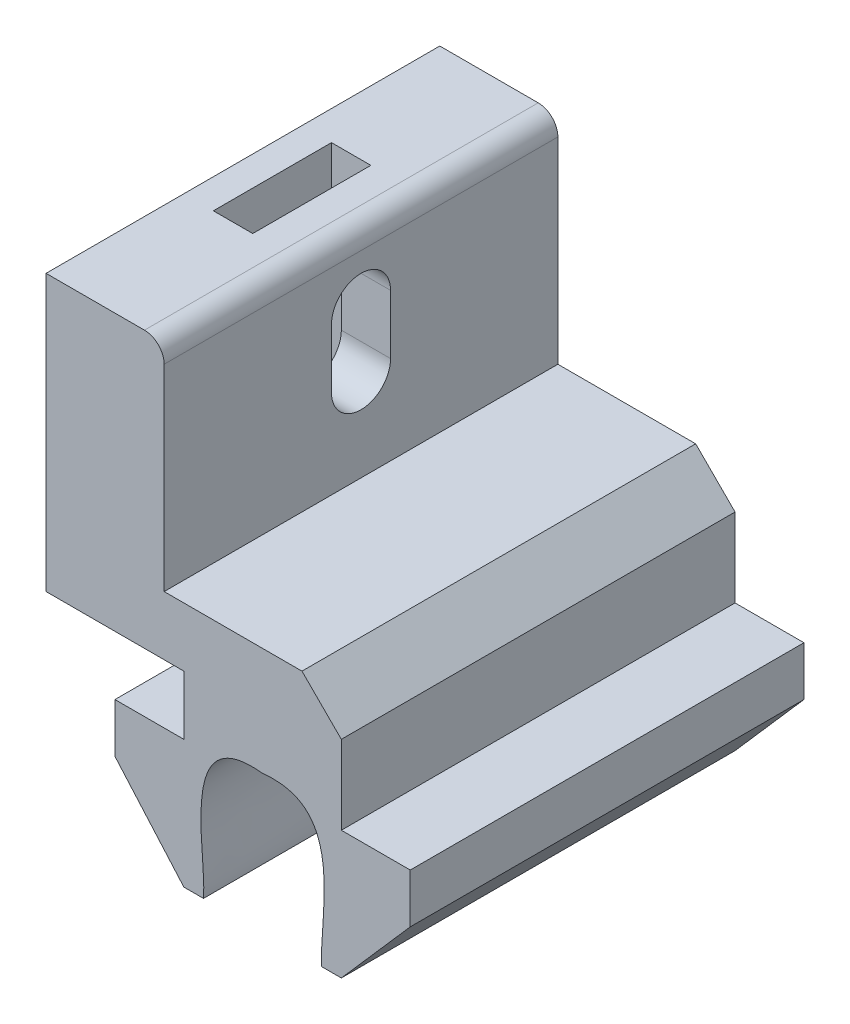
ISO-10303-21;
HEADER;
FILE_DESCRIPTION(('STEP AP214'),'2;1');
FILE_NAME('part.step','',(''),(''),'','','');
FILE_SCHEMA(('AUTOMOTIVE_DESIGN { 1 0 10303 214 1 1 1 1 }'));
ENDSEC;
DATA;
#1=APPLICATION_CONTEXT('core data for automotive mechanical design processes');
#2=APPLICATION_PROTOCOL_DEFINITION('international standard','automotive_design',2000,#1);
#3=PRODUCT_CONTEXT('',#1,'mechanical');
#4=PRODUCT('Part','Part','',(#3));
#5=PRODUCT_RELATED_PRODUCT_CATEGORY('part','',(#4));
#6=PRODUCT_DEFINITION_FORMATION('','',#4);
#7=PRODUCT_DEFINITION_CONTEXT('part definition',#1,'design');
#8=PRODUCT_DEFINITION('design','',#6,#7);
#9=PRODUCT_DEFINITION_SHAPE('','',#8);
#10=(LENGTH_UNIT() NAMED_UNIT(*) SI_UNIT(.MILLI.,.METRE.));
#11=(NAMED_UNIT(*) PLANE_ANGLE_UNIT() SI_UNIT($,.RADIAN.));
#12=(NAMED_UNIT(*) SI_UNIT($,.STERADIAN.) SOLID_ANGLE_UNIT());
#13=UNCERTAINTY_MEASURE_WITH_UNIT(LENGTH_MEASURE(1.E-05),#10,'distance_accuracy_value','');
#14=(GEOMETRIC_REPRESENTATION_CONTEXT(3) GLOBAL_UNCERTAINTY_ASSIGNED_CONTEXT((#13)) GLOBAL_UNIT_ASSIGNED_CONTEXT((#10,
#11,#12)) REPRESENTATION_CONTEXT('',''));
#15=CARTESIAN_POINT('',(0.,0.,0.));
#16=DIRECTION('',(0.,0.,1.));
#17=DIRECTION('',(1.,0.,0.));
#18=AXIS2_PLACEMENT_3D('',#15,#16,#17);
#19=CARTESIAN_POINT('',(-4.,0.,-20.));
#20=DIRECTION('',(0.,-1.,0.));
#21=DIRECTION('',(1.,0.,0.));
#22=AXIS2_PLACEMENT_3D('',#19,#20,#21);
#23=PLANE('',#22);
#24=DIRECTION('',(1.,0.,0.));
#25=VECTOR('',#24,1.);
#26=CARTESIAN_POINT('',(-4.,0.,0.));
#27=LINE('',#26,#25);
#28=CARTESIAN_POINT('',(3.,0.,0.));
#29=VERTEX_POINT('',#28);
#30=CARTESIAN_POINT('',(4.,0.,0.));
#31=VERTEX_POINT('',#30);
#32=EDGE_CURVE('E244',#29,#31,#27,.T.);
#33=ORIENTED_EDGE('',*,*,#32,.F.);
#34=DIRECTION('',(0.,0.,1.));
#35=VECTOR('',#34,1.);
#36=CARTESIAN_POINT('',(3.,0.,-75.5989507937651));
#37=LINE('',#36,#35);
#38=CARTESIAN_POINT('',(3.,0.,-20.));
#39=VERTEX_POINT('',#38);
#40=EDGE_CURVE('E528',#39,#29,#37,.T.);
#41=ORIENTED_EDGE('',*,*,#40,.F.);
#42=DIRECTION('',(1.,0.,0.));
#43=VECTOR('',#42,1.);
#44=CARTESIAN_POINT('',(-4.,0.,-20.));
#45=LINE('',#44,#43);
#46=CARTESIAN_POINT('',(4.,0.,-20.));
#47=VERTEX_POINT('',#46);
#48=EDGE_CURVE('E391',#39,#47,#45,.T.);
#49=ORIENTED_EDGE('',*,*,#48,.T.);
#50=DIRECTION('',(0.,0.,1.));
#51=VECTOR('',#50,1.);
#52=CARTESIAN_POINT('',(4.,0.,-20.));
#53=LINE('',#52,#51);
#54=EDGE_CURVE('E309',#47,#31,#53,.T.);
#55=ORIENTED_EDGE('',*,*,#54,.T.);
#56=EDGE_LOOP('',(#33,#41,#49,#55));
#57=FACE_BOUND('',#56,.T.);
#58=ADVANCED_FACE('F33',(#57),#23,.T.);
#59=CARTESIAN_POINT('',(-4.,0.,-20.));
#60=VERTEX_POINT('',#59);
#61=CARTESIAN_POINT('',(-3.,0.,-20.));
#62=VERTEX_POINT('',#61);
#63=EDGE_CURVE('E251',#60,#62,#45,.T.);
#64=ORIENTED_EDGE('',*,*,#63,.T.);
#65=DIRECTION('',(0.,0.,1.));
#66=VECTOR('',#65,1.);
#67=CARTESIAN_POINT('',(-3.,0.,-75.5989507937651));
#68=LINE('',#67,#66);
#69=CARTESIAN_POINT('',(-3.,0.,0.));
#70=VERTEX_POINT('',#69);
#71=EDGE_CURVE('E248',#62,#70,#68,.T.);
#72=ORIENTED_EDGE('',*,*,#71,.T.);
#73=CARTESIAN_POINT('',(-4.,0.,0.));
#74=VERTEX_POINT('',#73);
#75=EDGE_CURVE('E233',#74,#70,#27,.T.);
#76=ORIENTED_EDGE('',*,*,#75,.F.);
#77=DIRECTION('',(0.,0.,1.));
#78=VECTOR('',#77,1.);
#79=CARTESIAN_POINT('',(-4.,0.,-20.));
#80=LINE('',#79,#78);
#81=EDGE_CURVE('E312',#60,#74,#80,.T.);
#82=ORIENTED_EDGE('',*,*,#81,.F.);
#83=EDGE_LOOP('',(#64,#72,#76,#82));
#84=FACE_BOUND('',#83,.T.);
#85=ADVANCED_FACE('F249',(#84),#23,.T.);
#86=CARTESIAN_POINT('',(-6.,22.5,-20.));
#87=DIRECTION('',(0.,0.,-1.));
#88=DIRECTION('',(-1.,0.,0.));
#89=AXIS2_PLACEMENT_3D('',#86,#87,#88);
#90=PLANE('',#89);
#91=DIRECTION('',(-1.,0.,0.));
#92=VECTOR('',#91,1.);
#93=CARTESIAN_POINT('',(-5.,12.5,-20.));
#94=LINE('',#93,#92);
#95=CARTESIAN_POINT('',(2.00000000000455,12.5,-20.));
#96=VERTEX_POINT('',#95);
#97=CARTESIAN_POINT('',(-5.,12.5,-20.));
#98=VERTEX_POINT('',#97);
#99=EDGE_CURVE('E295',#96,#98,#94,.T.);
#100=ORIENTED_EDGE('',*,*,#99,.F.);
#101=DIRECTION('',(-0.707106781186549,0.707106781186546,0.));
#102=VECTOR('',#101,1.);
#103=CARTESIAN_POINT('',(-6.99999999999774,21.5000000000023,-20.));
#104=LINE('',#103,#102);
#105=CARTESIAN_POINT('',(4.00000000000456,10.5,-20.));
#106=VERTEX_POINT('',#105);
#107=EDGE_CURVE('E11',#96,#106,#104,.F.);
#108=ORIENTED_EDGE('',*,*,#107,.T.);
#109=DIRECTION('',(0.,1.,0.));
#110=VECTOR('',#109,1.);
#111=CARTESIAN_POINT('',(4.00000000000456,9.5,-20.));
#112=LINE('',#111,#110);
#113=CARTESIAN_POINT('',(4.00000000000456,6.5,-20.));
#114=VERTEX_POINT('',#113);
#115=EDGE_CURVE('E288',#114,#106,#112,.T.);
#116=ORIENTED_EDGE('',*,*,#115,.F.);
#117=DIRECTION('',(-1.,0.,0.));
#118=VECTOR('',#117,1.);
#119=CARTESIAN_POINT('',(4.00000000000456,6.5,-20.));
#120=LINE('',#119,#118);
#121=CARTESIAN_POINT('',(7.5,6.5,-20.));
#122=VERTEX_POINT('',#121);
#123=EDGE_CURVE('E399',#122,#114,#120,.T.);
#124=ORIENTED_EDGE('',*,*,#123,.F.);
#125=DIRECTION('',(0.,1.,0.));
#126=VECTOR('',#125,1.);
#127=CARTESIAN_POINT('',(7.5,6.5,-20.));
#128=LINE('',#127,#126);
#129=CARTESIAN_POINT('',(7.5,4.,-20.));
#130=VERTEX_POINT('',#129);
#131=EDGE_CURVE('E396',#130,#122,#128,.T.);
#132=ORIENTED_EDGE('',*,*,#131,.F.);
#133=DIRECTION('',(0.658504607868518,0.752576694706878,0.));
#134=VECTOR('',#133,1.);
#135=CARTESIAN_POINT('',(7.5,4.,-20.));
#136=LINE('',#135,#134);
#137=EDGE_CURVE('E393',#47,#130,#136,.T.);
#138=ORIENTED_EDGE('',*,*,#137,.F.);
#139=ORIENTED_EDGE('',*,*,#48,.F.);
#140=CARTESIAN_POINT('',(0.,7.,-20.));
#141=CARTESIAN_POINT('',(4.37761775244767,7.50074554480348,-20.));
#142=CARTESIAN_POINT('',(2.83172102737694,2.14501164249104,-20.));
#143=CARTESIAN_POINT('',(3.,0.,-20.));
#144=B_SPLINE_CURVE_WITH_KNOTS('',3,(#140,#141,#142,#143),.UNSPECIFIED.,.F.,.F.,(4,4),(0.,1.),.UNSPECIFIED.);
#145=CARTESIAN_POINT('',(0.,7.,-20.));
#146=VERTEX_POINT('',#145);
#147=EDGE_CURVE('E527',#39,#146,#144,.F.);
#148=ORIENTED_EDGE('',*,*,#147,.T.);
#149=CARTESIAN_POINT('',(-3.,0.,-20.));
#150=CARTESIAN_POINT('',(-2.83172102737694,2.14501164249104,-20.));
#151=CARTESIAN_POINT('',(-4.37761775244766,7.50074554480348,-20.));
#152=CARTESIAN_POINT('',(0.,7.,-20.));
#153=B_SPLINE_CURVE_WITH_KNOTS('',3,(#149,#150,#151,#152),.UNSPECIFIED.,.F.,.F.,(4,4),(0.,1.),.UNSPECIFIED.);
#154=EDGE_CURVE('E524',#146,#62,#153,.F.);
#155=ORIENTED_EDGE('',*,*,#154,.T.);
#156=ORIENTED_EDGE('',*,*,#63,.F.);
#157=DIRECTION('',(0.658504607868518,-0.752576694706878,0.));
#158=VECTOR('',#157,1.);
#159=CARTESIAN_POINT('',(-7.5,4.,-20.));
#160=LINE('',#159,#158);
#161=CARTESIAN_POINT('',(-7.5,4.,-20.));
#162=VERTEX_POINT('',#161);
#163=EDGE_CURVE('E388',#162,#60,#160,.T.);
#164=ORIENTED_EDGE('',*,*,#163,.F.);
#165=DIRECTION('',(0.,-1.,0.));
#166=VECTOR('',#165,1.);
#167=CARTESIAN_POINT('',(-7.5,6.5,-20.));
#168=LINE('',#167,#166);
#169=CARTESIAN_POINT('',(-7.5,6.5,-20.));
#170=VERTEX_POINT('',#169);
#171=EDGE_CURVE('E385',#170,#162,#168,.T.);
#172=ORIENTED_EDGE('',*,*,#171,.F.);
#173=DIRECTION('',(-1.,0.,0.));
#174=VECTOR('',#173,1.);
#175=CARTESIAN_POINT('',(-4.00000000000456,6.5,-20.));
#176=LINE('',#175,#174);
#177=CARTESIAN_POINT('',(-4.00000000000456,6.5,-20.));
#178=VERTEX_POINT('',#177);
#179=EDGE_CURVE('E382',#178,#170,#176,.T.);
#180=ORIENTED_EDGE('',*,*,#179,.F.);
#181=DIRECTION('',(0.,-1.,0.));
#182=VECTOR('',#181,1.);
#183=CARTESIAN_POINT('',(-4.00000000000456,9.5,-20.));
#184=LINE('',#183,#182);
#185=CARTESIAN_POINT('',(-4.00000000000456,9.5,-20.));
#186=VERTEX_POINT('',#185);
#187=EDGE_CURVE('E379',#186,#178,#184,.T.);
#188=ORIENTED_EDGE('',*,*,#187,.F.);
#189=DIRECTION('',(1.,0.,0.));
#190=VECTOR('',#189,1.);
#191=CARTESIAN_POINT('',(-4.00000000000456,9.5,-20.));
#192=LINE('',#191,#190);
#193=CARTESIAN_POINT('',(-11.,9.5,-20.));
#194=VERTEX_POINT('',#193);
#195=EDGE_CURVE('E376',#194,#186,#192,.T.);
#196=ORIENTED_EDGE('',*,*,#195,.F.);
#197=DIRECTION('',(0.,-1.,0.));
#198=VECTOR('',#197,1.);
#199=CARTESIAN_POINT('',(-11.,9.5,-20.));
#200=LINE('',#199,#198);
#201=CARTESIAN_POINT('',(-11.,23.5,-20.));
#202=VERTEX_POINT('',#201);
#203=EDGE_CURVE('E373',#202,#194,#200,.T.);
#204=ORIENTED_EDGE('',*,*,#203,.F.);
#205=DIRECTION('',(-1.,0.,0.));
#206=VECTOR('',#205,1.);
#207=CARTESIAN_POINT('',(-11.,23.5,-20.));
#208=LINE('',#207,#206);
#209=CARTESIAN_POINT('',(-6.,23.5,-20.));
#210=VERTEX_POINT('',#209);
#211=EDGE_CURVE('E370',#210,#202,#208,.T.);
#212=ORIENTED_EDGE('',*,*,#211,.F.);
#213=CARTESIAN_POINT('',(-6.,22.5,-20.));
#214=DIRECTION('',(0.,0.,1.));
#215=DIRECTION('',(-1.,0.,0.));
#216=AXIS2_PLACEMENT_3D('',#213,#214,#215);
#217=CIRCLE('',#216,1.);
#218=CARTESIAN_POINT('',(-5.,22.5,-20.));
#219=VERTEX_POINT('',#218);
#220=EDGE_CURVE('E367',#219,#210,#217,.T.);
#221=ORIENTED_EDGE('',*,*,#220,.F.);
#222=DIRECTION('',(0.,1.,0.));
#223=VECTOR('',#222,1.);
#224=CARTESIAN_POINT('',(-5.,22.5,-20.));
#225=LINE('',#224,#223);
#226=EDGE_CURVE('E297',#98,#219,#225,.T.);
#227=ORIENTED_EDGE('',*,*,#226,.F.);
#228=EDGE_LOOP('',(#100,#108,#116,#124,#132,#138,#139,#148,#155,#156,#164,#172,#180,#188,#196,
#204,#212,#221,#227));
#229=FACE_BOUND('',#228,.T.);
#230=ADVANCED_FACE('F438',(#229),#90,.T.);
#231=CARTESIAN_POINT('',(-6.,22.5,0.));
#232=DIRECTION('',(0.,0.,-1.));
#233=DIRECTION('',(-1.,0.,0.));
#234=AXIS2_PLACEMENT_3D('',#231,#232,#233);
#235=PLANE('',#234);
#236=DIRECTION('',(0.,1.,0.));
#237=VECTOR('',#236,1.);
#238=CARTESIAN_POINT('',(4.00000000000456,12.5,0.));
#239=LINE('',#238,#237);
#240=CARTESIAN_POINT('',(4.00000000000456,6.5,0.));
#241=VERTEX_POINT('',#240);
#242=CARTESIAN_POINT('',(4.00000000000456,10.5,0.));
#243=VERTEX_POINT('',#242);
#244=EDGE_CURVE('E285',#241,#243,#239,.T.);
#245=ORIENTED_EDGE('',*,*,#244,.T.);
#246=DIRECTION('',(0.707106781186549,-0.707106781186546,0.));
#247=VECTOR('',#246,1.);
#248=CARTESIAN_POINT('',(4.00000000000456,10.5,0.));
#249=LINE('',#248,#247);
#250=CARTESIAN_POINT('',(2.00000000000455,12.5,0.));
#251=VERTEX_POINT('',#250);
#252=EDGE_CURVE('E55',#243,#251,#249,.F.);
#253=ORIENTED_EDGE('',*,*,#252,.T.);
#254=DIRECTION('',(-1.,0.,0.));
#255=VECTOR('',#254,1.);
#256=CARTESIAN_POINT('',(-5.,12.5,0.));
#257=LINE('',#256,#255);
#258=CARTESIAN_POINT('',(-5.,12.5,0.));
#259=VERTEX_POINT('',#258);
#260=EDGE_CURVE('E362',#251,#259,#257,.T.);
#261=ORIENTED_EDGE('',*,*,#260,.T.);
#262=DIRECTION('',(0.,1.,0.));
#263=VECTOR('',#262,1.);
#264=CARTESIAN_POINT('',(-5.,22.5,0.));
#265=LINE('',#264,#263);
#266=CARTESIAN_POINT('',(-5.,22.5,0.));
#267=VERTEX_POINT('',#266);
#268=EDGE_CURVE('E404',#259,#267,#265,.T.);
#269=ORIENTED_EDGE('',*,*,#268,.T.);
#270=CARTESIAN_POINT('',(-6.,22.5,0.));
#271=DIRECTION('',(0.,0.,1.));
#272=DIRECTION('',(-1.,0.,0.));
#273=AXIS2_PLACEMENT_3D('',#270,#271,#272);
#274=CIRCLE('',#273,1.);
#275=CARTESIAN_POINT('',(-6.,23.5,0.));
#276=VERTEX_POINT('',#275);
#277=EDGE_CURVE('E407',#267,#276,#274,.T.);
#278=ORIENTED_EDGE('',*,*,#277,.T.);
#279=DIRECTION('',(-1.,0.,0.));
#280=VECTOR('',#279,1.);
#281=CARTESIAN_POINT('',(-11.,23.5,0.));
#282=LINE('',#281,#280);
#283=CARTESIAN_POINT('',(-11.,23.5,0.));
#284=VERTEX_POINT('',#283);
#285=EDGE_CURVE('E410',#276,#284,#282,.T.);
#286=ORIENTED_EDGE('',*,*,#285,.T.);
#287=DIRECTION('',(0.,-1.,0.));
#288=VECTOR('',#287,1.);
#289=CARTESIAN_POINT('',(-11.,9.5,0.));
#290=LINE('',#289,#288);
#291=CARTESIAN_POINT('',(-11.,9.5,0.));
#292=VERTEX_POINT('',#291);
#293=EDGE_CURVE('E413',#284,#292,#290,.T.);
#294=ORIENTED_EDGE('',*,*,#293,.T.);
#295=DIRECTION('',(1.,0.,0.));
#296=VECTOR('',#295,1.);
#297=CARTESIAN_POINT('',(-4.00000000000456,9.5,0.));
#298=LINE('',#297,#296);
#299=CARTESIAN_POINT('',(-4.00000000000456,9.5,0.));
#300=VERTEX_POINT('',#299);
#301=EDGE_CURVE('E416',#292,#300,#298,.T.);
#302=ORIENTED_EDGE('',*,*,#301,.T.);
#303=DIRECTION('',(0.,-1.,0.));
#304=VECTOR('',#303,1.);
#305=CARTESIAN_POINT('',(-4.00000000000456,9.5,0.));
#306=LINE('',#305,#304);
#307=CARTESIAN_POINT('',(-4.00000000000456,6.5,0.));
#308=VERTEX_POINT('',#307);
#309=EDGE_CURVE('E419',#300,#308,#306,.T.);
#310=ORIENTED_EDGE('',*,*,#309,.T.);
#311=DIRECTION('',(-1.,0.,0.));
#312=VECTOR('',#311,1.);
#313=CARTESIAN_POINT('',(-4.00000000000456,6.5,0.));
#314=LINE('',#313,#312);
#315=CARTESIAN_POINT('',(-7.5,6.5,0.));
#316=VERTEX_POINT('',#315);
#317=EDGE_CURVE('E422',#308,#316,#314,.T.);
#318=ORIENTED_EDGE('',*,*,#317,.T.);
#319=DIRECTION('',(0.,-1.,0.));
#320=VECTOR('',#319,1.);
#321=CARTESIAN_POINT('',(-7.5,6.5,0.));
#322=LINE('',#321,#320);
#323=CARTESIAN_POINT('',(-7.5,4.,0.));
#324=VERTEX_POINT('',#323);
#325=EDGE_CURVE('E425',#316,#324,#322,.T.);
#326=ORIENTED_EDGE('',*,*,#325,.T.);
#327=DIRECTION('',(0.658504607868518,-0.752576694706878,0.));
#328=VECTOR('',#327,1.);
#329=CARTESIAN_POINT('',(-7.5,4.,0.));
#330=LINE('',#329,#328);
#331=EDGE_CURVE('E241',#324,#74,#330,.T.);
#332=ORIENTED_EDGE('',*,*,#331,.T.);
#333=ORIENTED_EDGE('',*,*,#75,.T.);
#334=CARTESIAN_POINT('',(-3.,0.,0.));
#335=CARTESIAN_POINT('',(-2.83172102737694,2.14501164249104,0.));
#336=CARTESIAN_POINT('',(-4.37761775244766,7.50074554480348,0.));
#337=CARTESIAN_POINT('',(0.,7.,0.));
#338=B_SPLINE_CURVE_WITH_KNOTS('',3,(#334,#335,#336,#337),.UNSPECIFIED.,.F.,.F.,(4,4),(0.,1.),.UNSPECIFIED.);
#339=CARTESIAN_POINT('',(0.,7.,0.));
#340=VERTEX_POINT('',#339);
#341=EDGE_CURVE('E237',#340,#70,#338,.F.);
#342=ORIENTED_EDGE('',*,*,#341,.F.);
#343=CARTESIAN_POINT('',(0.,7.,0.));
#344=CARTESIAN_POINT('',(4.37761775244767,7.50074554480348,0.));
#345=CARTESIAN_POINT('',(2.83172102737694,2.14501164249104,0.));
#346=CARTESIAN_POINT('',(3.,0.,0.));
#347=B_SPLINE_CURVE_WITH_KNOTS('',3,(#343,#344,#345,#346),.UNSPECIFIED.,.F.,.F.,(4,4),(0.,1.),.UNSPECIFIED.);
#348=EDGE_CURVE('E259',#29,#340,#347,.F.);
#349=ORIENTED_EDGE('',*,*,#348,.F.);
#350=ORIENTED_EDGE('',*,*,#32,.T.);
#351=DIRECTION('',(0.658504607868518,0.752576694706878,0.));
#352=VECTOR('',#351,1.);
#353=CARTESIAN_POINT('',(7.5,4.,0.));
#354=LINE('',#353,#352);
#355=CARTESIAN_POINT('',(7.5,4.,0.));
#356=VERTEX_POINT('',#355);
#357=EDGE_CURVE('E243',#31,#356,#354,.T.);
#358=ORIENTED_EDGE('',*,*,#357,.T.);
#359=DIRECTION('',(0.,1.,0.));
#360=VECTOR('',#359,1.);
#361=CARTESIAN_POINT('',(7.5,6.5,0.));
#362=LINE('',#361,#360);
#363=CARTESIAN_POINT('',(7.5,6.5,0.));
#364=VERTEX_POINT('',#363);
#365=EDGE_CURVE('E299',#356,#364,#362,.T.);
#366=ORIENTED_EDGE('',*,*,#365,.T.);
#367=DIRECTION('',(-1.,0.,0.));
#368=VECTOR('',#367,1.);
#369=CARTESIAN_POINT('',(4.00000000000456,6.5,0.));
#370=LINE('',#369,#368);
#371=EDGE_CURVE('E294',#364,#241,#370,.T.);
#372=ORIENTED_EDGE('',*,*,#371,.T.);
#373=EDGE_LOOP('',(#245,#253,#261,#269,#278,#286,#294,#302,#310,#318,#326,#332,#333,#342,#349,
#350,#358,#366,#372));
#374=FACE_BOUND('',#373,.T.);
#375=ADVANCED_FACE('F235',(#374),#235,.F.);
#376=CARTESIAN_POINT('',(7.501,20.,-10.));
#377=DIRECTION('',(-1.,0.,0.));
#378=DIRECTION('',(0.,0.,1.));
#379=AXIS2_PLACEMENT_3D('',#376,#377,#378);
#380=CYLINDRICAL_SURFACE('',#379,1.5);
#381=DIRECTION('',(-1.,0.,0.));
#382=VECTOR('',#381,1.);
#383=CARTESIAN_POINT('',(7.501,20.,-11.5));
#384=LINE('',#383,#382);
#385=CARTESIAN_POINT('',(-9.5,20.,-11.5));
#386=VERTEX_POINT('',#385);
#387=CARTESIAN_POINT('',(-11.,20.,-11.5));
#388=VERTEX_POINT('',#387);
#389=EDGE_CURVE('E360',#386,#388,#384,.T.);
#390=ORIENTED_EDGE('',*,*,#389,.F.);
#391=CARTESIAN_POINT('',(-9.5,20.,-10.));
#392=DIRECTION('',(-1.,0.,0.));
#393=DIRECTION('',(0.,0.,1.));
#394=AXIS2_PLACEMENT_3D('',#391,#392,#393);
#395=CIRCLE('',#394,1.5);
#396=CARTESIAN_POINT('',(-9.5,20.,-8.5));
#397=VERTEX_POINT('',#396);
#398=EDGE_CURVE('E589',#386,#397,#395,.F.);
#399=ORIENTED_EDGE('',*,*,#398,.T.);
#400=DIRECTION('',(-1.,0.,0.));
#401=VECTOR('',#400,1.);
#402=CARTESIAN_POINT('',(7.501,20.,-8.5));
#403=LINE('',#402,#401);
#404=CARTESIAN_POINT('',(-11.,20.,-8.5));
#405=VERTEX_POINT('',#404);
#406=EDGE_CURVE('E611',#397,#405,#403,.T.);
#407=ORIENTED_EDGE('',*,*,#406,.T.);
#408=CARTESIAN_POINT('',(-11.,20.,-10.));
#409=DIRECTION('',(-1.,0.,0.));
#410=DIRECTION('',(0.,0.,1.));
#411=AXIS2_PLACEMENT_3D('',#408,#409,#410);
#412=CIRCLE('',#411,1.5);
#413=EDGE_CURVE('E599',#405,#388,#412,.T.);
#414=ORIENTED_EDGE('',*,*,#413,.T.);
#415=EDGE_LOOP('',(#390,#399,#407,#414));
#416=FACE_BOUND('',#415,.T.);
#417=ADVANCED_FACE('F647',(#416),#380,.F.);
#418=CARTESIAN_POINT('',(7.501,20.,-8.5));
#419=DIRECTION('',(0.,0.,1.));
#420=DIRECTION('',(0.,-1.,0.));
#421=AXIS2_PLACEMENT_3D('',#418,#419,#420);
#422=PLANE('',#421);
#423=ORIENTED_EDGE('',*,*,#406,.F.);
#424=DIRECTION('',(0.,-1.,0.));
#425=VECTOR('',#424,1.);
#426=CARTESIAN_POINT('',(-9.5,20.,-8.5));
#427=LINE('',#426,#425);
#428=CARTESIAN_POINT('',(-9.5,17.,-8.49999999999999));
#429=VERTEX_POINT('',#428);
#430=EDGE_CURVE('E586',#397,#429,#427,.T.);
#431=ORIENTED_EDGE('',*,*,#430,.T.);
#432=DIRECTION('',(-1.,0.,0.));
#433=VECTOR('',#432,1.);
#434=CARTESIAN_POINT('',(7.501,17.,-8.5));
#435=LINE('',#434,#433);
#436=CARTESIAN_POINT('',(-11.,17.,-8.5));
#437=VERTEX_POINT('',#436);
#438=EDGE_CURVE('E352',#429,#437,#435,.T.);
#439=ORIENTED_EDGE('',*,*,#438,.T.);
#440=DIRECTION('',(0.,1.,0.));
#441=VECTOR('',#440,1.);
#442=CARTESIAN_POINT('',(-11.,20.,-8.5));
#443=LINE('',#442,#441);
#444=EDGE_CURVE('E608',#437,#405,#443,.T.);
#445=ORIENTED_EDGE('',*,*,#444,.T.);
#446=EDGE_LOOP('',(#423,#431,#439,#445));
#447=FACE_BOUND('',#446,.T.);
#448=ADVANCED_FACE('F641',(#447),#422,.F.);
#449=CARTESIAN_POINT('',(7.501,17.,-10.));
#450=DIRECTION('',(-1.,0.,0.));
#451=DIRECTION('',(0.,0.,1.));
#452=AXIS2_PLACEMENT_3D('',#449,#450,#451);
#453=CYLINDRICAL_SURFACE('',#452,1.5);
#454=ORIENTED_EDGE('',*,*,#438,.F.);
#455=CARTESIAN_POINT('',(-9.5,17.,-10.));
#456=DIRECTION('',(-1.,0.,0.));
#457=DIRECTION('',(0.,0.,1.));
#458=AXIS2_PLACEMENT_3D('',#455,#456,#457);
#459=CIRCLE('',#458,1.5);
#460=CARTESIAN_POINT('',(-9.5,17.,-11.5));
#461=VERTEX_POINT('',#460);
#462=EDGE_CURVE('E583',#429,#461,#459,.F.);
#463=ORIENTED_EDGE('',*,*,#462,.T.);
#464=DIRECTION('',(-1.,0.,0.));
#465=VECTOR('',#464,1.);
#466=CARTESIAN_POINT('',(7.501,17.,-11.5));
#467=LINE('',#466,#465);
#468=CARTESIAN_POINT('',(-11.,17.,-11.5));
#469=VERTEX_POINT('',#468);
#470=EDGE_CURVE('E353',#461,#469,#467,.T.);
#471=ORIENTED_EDGE('',*,*,#470,.T.);
#472=CARTESIAN_POINT('',(-11.,17.,-10.));
#473=DIRECTION('',(-1.,0.,0.));
#474=DIRECTION('',(0.,0.,1.));
#475=AXIS2_PLACEMENT_3D('',#472,#473,#474);
#476=CIRCLE('',#475,1.5);
#477=EDGE_CURVE('E605',#469,#437,#476,.T.);
#478=ORIENTED_EDGE('',*,*,#477,.T.);
#479=EDGE_LOOP('',(#454,#463,#471,#478));
#480=FACE_BOUND('',#479,.T.);
#481=ADVANCED_FACE('F501',(#480),#453,.F.);
#482=CARTESIAN_POINT('',(7.501,20.,-11.5));
#483=DIRECTION('',(0.,0.,-1.));
#484=DIRECTION('',(0.,1.,0.));
#485=AXIS2_PLACEMENT_3D('',#482,#483,#484);
#486=PLANE('',#485);
#487=ORIENTED_EDGE('',*,*,#470,.F.);
#488=DIRECTION('',(0.,1.,0.));
#489=VECTOR('',#488,1.);
#490=CARTESIAN_POINT('',(-9.5,20.,-11.5));
#491=LINE('',#490,#489);
#492=EDGE_CURVE('E260',#461,#386,#491,.T.);
#493=ORIENTED_EDGE('',*,*,#492,.T.);
#494=ORIENTED_EDGE('',*,*,#389,.T.);
#495=DIRECTION('',(0.,-1.,0.));
#496=VECTOR('',#495,1.);
#497=CARTESIAN_POINT('',(-11.,20.,-11.5));
#498=LINE('',#497,#496);
#499=EDGE_CURVE('E602',#388,#469,#498,.T.);
#500=ORIENTED_EDGE('',*,*,#499,.T.);
#501=EDGE_LOOP('',(#487,#493,#494,#500));
#502=FACE_BOUND('',#501,.T.);
#503=ADVANCED_FACE('F495',(#502),#486,.F.);
#504=CARTESIAN_POINT('',(-5.,12.5,-20.));
#505=DIRECTION('',(0.,1.,0.));
#506=DIRECTION('',(-1.,0.,0.));
#507=AXIS2_PLACEMENT_3D('',#504,#505,#506);
#508=PLANE('',#507);
#509=ORIENTED_EDGE('',*,*,#260,.F.);
#510=DIRECTION('',(0.,0.,-1.));
#511=VECTOR('',#510,1.);
#512=CARTESIAN_POINT('',(2.00000000000455,12.5,-20.));
#513=LINE('',#512,#511);
#514=EDGE_CURVE('E41',#251,#96,#513,.T.);
#515=ORIENTED_EDGE('',*,*,#514,.T.);
#516=ORIENTED_EDGE('',*,*,#99,.T.);
#517=DIRECTION('',(0.,0.,1.));
#518=VECTOR('',#517,1.);
#519=CARTESIAN_POINT('',(-5.,12.5,-20.));
#520=LINE('',#519,#518);
#521=EDGE_CURVE('E330',#98,#259,#520,.T.);
#522=ORIENTED_EDGE('',*,*,#521,.T.);
#523=EDGE_LOOP('',(#509,#515,#516,#522));
#524=FACE_BOUND('',#523,.T.);
#525=ADVANCED_FACE('F493',(#524),#508,.T.);
#526=CARTESIAN_POINT('',(4.00000000000456,12.5,-20.));
#527=DIRECTION('',(1.,0.,0.));
#528=DIRECTION('',(0.,1.,0.));
#529=AXIS2_PLACEMENT_3D('',#526,#527,#528);
#530=PLANE('',#529);
#531=ORIENTED_EDGE('',*,*,#115,.T.);
#532=DIRECTION('',(0.,0.,1.));
#533=VECTOR('',#532,1.);
#534=CARTESIAN_POINT('',(4.00000000000456,10.5,-20.));
#535=LINE('',#534,#533);
#536=EDGE_CURVE('E262',#106,#243,#535,.T.);
#537=ORIENTED_EDGE('',*,*,#536,.T.);
#538=ORIENTED_EDGE('',*,*,#244,.F.);
#539=DIRECTION('',(0.,0.,1.));
#540=VECTOR('',#539,1.);
#541=CARTESIAN_POINT('',(4.00000000000456,6.5,-20.));
#542=LINE('',#541,#540);
#543=EDGE_CURVE('E303',#114,#241,#542,.T.);
#544=ORIENTED_EDGE('',*,*,#543,.F.);
#545=EDGE_LOOP('',(#531,#537,#538,#544));
#546=FACE_BOUND('',#545,.T.);
#547=ADVANCED_FACE('F284',(#546),#530,.T.);
#548=CARTESIAN_POINT('',(4.00000000000456,6.5,-20.));
#549=DIRECTION('',(0.,1.,0.));
#550=DIRECTION('',(0.,0.,1.));
#551=AXIS2_PLACEMENT_3D('',#548,#549,#550);
#552=PLANE('',#551);
#553=ORIENTED_EDGE('',*,*,#371,.F.);
#554=DIRECTION('',(0.,0.,1.));
#555=VECTOR('',#554,1.);
#556=CARTESIAN_POINT('',(7.5,6.5,-20.));
#557=LINE('',#556,#555);
#558=EDGE_CURVE('E305',#122,#364,#557,.T.);
#559=ORIENTED_EDGE('',*,*,#558,.F.);
#560=ORIENTED_EDGE('',*,*,#123,.T.);
#561=ORIENTED_EDGE('',*,*,#543,.T.);
#562=EDGE_LOOP('',(#553,#559,#560,#561));
#563=FACE_BOUND('',#562,.T.);
#564=ADVANCED_FACE('F436',(#563),#552,.T.);
#565=CARTESIAN_POINT('',(7.5,6.5,-20.));
#566=DIRECTION('',(1.,0.,0.));
#567=DIRECTION('',(0.,0.,-1.));
#568=AXIS2_PLACEMENT_3D('',#565,#566,#567);
#569=PLANE('',#568);
#570=ORIENTED_EDGE('',*,*,#365,.F.);
#571=DIRECTION('',(0.,0.,1.));
#572=VECTOR('',#571,1.);
#573=CARTESIAN_POINT('',(7.5,4.,-20.));
#574=LINE('',#573,#572);
#575=EDGE_CURVE('E307',#130,#356,#574,.T.);
#576=ORIENTED_EDGE('',*,*,#575,.F.);
#577=ORIENTED_EDGE('',*,*,#131,.T.);
#578=ORIENTED_EDGE('',*,*,#558,.T.);
#579=EDGE_LOOP('',(#570,#576,#577,#578));
#580=FACE_BOUND('',#579,.T.);
#581=ADVANCED_FACE('F432',(#580),#569,.T.);
#582=CARTESIAN_POINT('',(7.5,4.,-20.));
#583=DIRECTION('',(0.752576694706878,-0.658504607868518,0.));
#584=DIRECTION('',(0.658504607868518,0.752576694706878,0.));
#585=AXIS2_PLACEMENT_3D('',#582,#583,#584);
#586=PLANE('',#585);
#587=ORIENTED_EDGE('',*,*,#357,.F.);
#588=ORIENTED_EDGE('',*,*,#54,.F.);
#589=ORIENTED_EDGE('',*,*,#137,.T.);
#590=ORIENTED_EDGE('',*,*,#575,.T.);
#591=EDGE_LOOP('',(#587,#588,#589,#590));
#592=FACE_BOUND('',#591,.T.);
#593=ADVANCED_FACE('F455',(#592),#586,.T.);
#594=CARTESIAN_POINT('',(-7.5,4.,-20.));
#595=DIRECTION('',(-0.752576694706878,-0.658504607868518,0.));
#596=DIRECTION('',(0.658504607868518,-0.752576694706878,0.));
#597=AXIS2_PLACEMENT_3D('',#594,#595,#596);
#598=PLANE('',#597);
#599=ORIENTED_EDGE('',*,*,#331,.F.);
#600=DIRECTION('',(0.,0.,1.));
#601=VECTOR('',#600,1.);
#602=CARTESIAN_POINT('',(-7.5,4.,-20.));
#603=LINE('',#602,#601);
#604=EDGE_CURVE('E314',#162,#324,#603,.T.);
#605=ORIENTED_EDGE('',*,*,#604,.F.);
#606=ORIENTED_EDGE('',*,*,#163,.T.);
#607=ORIENTED_EDGE('',*,*,#81,.T.);
#608=EDGE_LOOP('',(#599,#605,#606,#607));
#609=FACE_BOUND('',#608,.T.);
#610=ADVANCED_FACE('F457',(#609),#598,.T.);
#611=CARTESIAN_POINT('',(-7.5,6.5,-20.));
#612=DIRECTION('',(-1.,0.,0.));
#613=DIRECTION('',(0.,0.,1.));
#614=AXIS2_PLACEMENT_3D('',#611,#612,#613);
#615=PLANE('',#614);
#616=ORIENTED_EDGE('',*,*,#325,.F.);
#617=DIRECTION('',(0.,0.,1.));
#618=VECTOR('',#617,1.);
#619=CARTESIAN_POINT('',(-7.5,6.5,-20.));
#620=LINE('',#619,#618);
#621=EDGE_CURVE('E316',#170,#316,#620,.T.);
#622=ORIENTED_EDGE('',*,*,#621,.F.);
#623=ORIENTED_EDGE('',*,*,#171,.T.);
#624=ORIENTED_EDGE('',*,*,#604,.T.);
#625=EDGE_LOOP('',(#616,#622,#623,#624));
#626=FACE_BOUND('',#625,.T.);
#627=ADVANCED_FACE('F460',(#626),#615,.T.);
#628=CARTESIAN_POINT('',(-4.00000000000456,6.5,-20.));
#629=DIRECTION('',(0.,1.,0.));
#630=DIRECTION('',(0.,0.,1.));
#631=AXIS2_PLACEMENT_3D('',#628,#629,#630);
#632=PLANE('',#631);
#633=ORIENTED_EDGE('',*,*,#317,.F.);
#634=DIRECTION('',(0.,0.,1.));
#635=VECTOR('',#634,1.);
#636=CARTESIAN_POINT('',(-4.00000000000456,6.5,-20.));
#637=LINE('',#636,#635);
#638=EDGE_CURVE('E318',#178,#308,#637,.T.);
#639=ORIENTED_EDGE('',*,*,#638,.F.);
#640=ORIENTED_EDGE('',*,*,#179,.T.);
#641=ORIENTED_EDGE('',*,*,#621,.T.);
#642=EDGE_LOOP('',(#633,#639,#640,#641));
#643=FACE_BOUND('',#642,.T.);
#644=ADVANCED_FACE('F464',(#643),#632,.T.);
#645=CARTESIAN_POINT('',(-4.00000000000456,9.5,-20.));
#646=DIRECTION('',(-1.,0.,0.));
#647=DIRECTION('',(0.,0.,1.));
#648=AXIS2_PLACEMENT_3D('',#645,#646,#647);
#649=PLANE('',#648);
#650=ORIENTED_EDGE('',*,*,#309,.F.);
#651=DIRECTION('',(0.,0.,1.));
#652=VECTOR('',#651,1.);
#653=CARTESIAN_POINT('',(-4.00000000000456,9.5,-20.));
#654=LINE('',#653,#652);
#655=EDGE_CURVE('E320',#186,#300,#654,.T.);
#656=ORIENTED_EDGE('',*,*,#655,.F.);
#657=ORIENTED_EDGE('',*,*,#187,.T.);
#658=ORIENTED_EDGE('',*,*,#638,.T.);
#659=EDGE_LOOP('',(#650,#656,#657,#658));
#660=FACE_BOUND('',#659,.T.);
#661=ADVANCED_FACE('F468',(#660),#649,.T.);
#662=CARTESIAN_POINT('',(-4.00000000000456,9.5,-20.));
#663=DIRECTION('',(0.,-1.,0.));
#664=DIRECTION('',(0.,0.,-1.));
#665=AXIS2_PLACEMENT_3D('',#662,#663,#664);
#666=PLANE('',#665);
#667=ORIENTED_EDGE('',*,*,#301,.F.);
#668=DIRECTION('',(0.,0.,1.));
#669=VECTOR('',#668,1.);
#670=CARTESIAN_POINT('',(-11.,9.5,-20.));
#671=LINE('',#670,#669);
#672=EDGE_CURVE('E322',#194,#292,#671,.T.);
#673=ORIENTED_EDGE('',*,*,#672,.F.);
#674=ORIENTED_EDGE('',*,*,#195,.T.);
#675=ORIENTED_EDGE('',*,*,#655,.T.);
#676=EDGE_LOOP('',(#667,#673,#674,#675));
#677=FACE_BOUND('',#676,.T.);
#678=ADVANCED_FACE('F472',(#677),#666,.T.);
#679=CARTESIAN_POINT('',(-11.,9.5,-20.));
#680=DIRECTION('',(-1.,0.,0.));
#681=DIRECTION('',(0.,-1.,0.));
#682=AXIS2_PLACEMENT_3D('',#679,#680,#681);
#683=PLANE('',#682);
#684=ORIENTED_EDGE('',*,*,#413,.F.);
#685=ORIENTED_EDGE('',*,*,#444,.F.);
#686=ORIENTED_EDGE('',*,*,#477,.F.);
#687=ORIENTED_EDGE('',*,*,#499,.F.);
#688=EDGE_LOOP('',(#684,#685,#686,#687));
#689=FACE_BOUND('',#688,.T.);
#690=ORIENTED_EDGE('',*,*,#293,.F.);
#691=DIRECTION('',(0.,0.,1.));
#692=VECTOR('',#691,1.);
#693=CARTESIAN_POINT('',(-11.,23.5,-20.));
#694=LINE('',#693,#692);
#695=EDGE_CURVE('E324',#202,#284,#694,.T.);
#696=ORIENTED_EDGE('',*,*,#695,.F.);
#697=ORIENTED_EDGE('',*,*,#203,.T.);
#698=ORIENTED_EDGE('',*,*,#672,.T.);
#699=EDGE_LOOP('',(#690,#696,#697,#698));
#700=FACE_BOUND('',#699,.T.);
#701=ADVANCED_FACE('F476',(#689,#700),#683,.T.);
#702=CARTESIAN_POINT('',(-11.,23.5,-20.));
#703=DIRECTION('',(0.,1.,0.));
#704=DIRECTION('',(0.,0.,1.));
#705=AXIS2_PLACEMENT_3D('',#702,#703,#704);
#706=PLANE('',#705);
#707=DIRECTION('',(0.,0.,1.));
#708=VECTOR('',#707,1.);
#709=CARTESIAN_POINT('',(-9.5,23.5,-7.));
#710=LINE('',#709,#708);
#711=CARTESIAN_POINT('',(-9.5,23.5,-13.));
#712=VERTEX_POINT('',#711);
#713=CARTESIAN_POINT('',(-9.5,23.5,-7.));
#714=VERTEX_POINT('',#713);
#715=EDGE_CURVE('E530',#712,#714,#710,.T.);
#716=ORIENTED_EDGE('',*,*,#715,.F.);
#717=DIRECTION('',(-1.,0.,0.));
#718=VECTOR('',#717,1.);
#719=CARTESIAN_POINT('',(-7.5,23.5,-13.));
#720=LINE('',#719,#718);
#721=CARTESIAN_POINT('',(-7.5,23.5,-13.));
#722=VERTEX_POINT('',#721);
#723=EDGE_CURVE('E550',#722,#712,#720,.T.);
#724=ORIENTED_EDGE('',*,*,#723,.F.);
#725=DIRECTION('',(0.,0.,-1.));
#726=VECTOR('',#725,1.);
#727=CARTESIAN_POINT('',(-7.5,23.5,-7.));
#728=LINE('',#727,#726);
#729=CARTESIAN_POINT('',(-7.5,23.5,-7.));
#730=VERTEX_POINT('',#729);
#731=EDGE_CURVE('E564',#730,#722,#728,.T.);
#732=ORIENTED_EDGE('',*,*,#731,.F.);
#733=DIRECTION('',(1.,0.,0.));
#734=VECTOR('',#733,1.);
#735=CARTESIAN_POINT('',(-7.5,23.5,-7.));
#736=LINE('',#735,#734);
#737=EDGE_CURVE('E561',#714,#730,#736,.T.);
#738=ORIENTED_EDGE('',*,*,#737,.F.);
#739=EDGE_LOOP('',(#716,#724,#732,#738));
#740=FACE_BOUND('',#739,.T.);
#741=ORIENTED_EDGE('',*,*,#285,.F.);
#742=DIRECTION('',(0.,0.,1.));
#743=VECTOR('',#742,1.);
#744=CARTESIAN_POINT('',(-6.,23.5,-20.));
#745=LINE('',#744,#743);
#746=EDGE_CURVE('E326',#210,#276,#745,.T.);
#747=ORIENTED_EDGE('',*,*,#746,.F.);
#748=ORIENTED_EDGE('',*,*,#211,.T.);
#749=ORIENTED_EDGE('',*,*,#695,.T.);
#750=EDGE_LOOP('',(#741,#747,#748,#749));
#751=FACE_BOUND('',#750,.T.);
#752=ADVANCED_FACE('F480',(#740,#751),#706,.T.);
#753=CARTESIAN_POINT('',(-6.,22.5,-20.));
#754=DIRECTION('',(0.,0.,1.));
#755=DIRECTION('',(1.,0.,0.));
#756=AXIS2_PLACEMENT_3D('',#753,#754,#755);
#757=CYLINDRICAL_SURFACE('',#756,1.);
#758=ORIENTED_EDGE('',*,*,#277,.F.);
#759=DIRECTION('',(0.,0.,1.));
#760=VECTOR('',#759,1.);
#761=CARTESIAN_POINT('',(-5.,22.5,-20.));
#762=LINE('',#761,#760);
#763=EDGE_CURVE('E328',#219,#267,#762,.T.);
#764=ORIENTED_EDGE('',*,*,#763,.F.);
#765=ORIENTED_EDGE('',*,*,#220,.T.);
#766=ORIENTED_EDGE('',*,*,#746,.T.);
#767=EDGE_LOOP('',(#758,#764,#765,#766));
#768=FACE_BOUND('',#767,.T.);
#769=ADVANCED_FACE('F484',(#768),#757,.T.);
#770=CARTESIAN_POINT('',(-5.,22.5,-20.));
#771=DIRECTION('',(1.,0.,0.));
#772=DIRECTION('',(0.,0.,-1.));
#773=AXIS2_PLACEMENT_3D('',#770,#771,#772);
#774=PLANE('',#773);
#775=CARTESIAN_POINT('',(-5.,20.,-10.));
#776=DIRECTION('',(1.,0.,0.));
#777=DIRECTION('',(0.,0.,-1.));
#778=AXIS2_PLACEMENT_3D('',#775,#776,#777);
#779=CIRCLE('',#778,1.5);
#780=CARTESIAN_POINT('',(-5.,20.,-8.5));
#781=VERTEX_POINT('',#780);
#782=CARTESIAN_POINT('',(-5.,20.,-11.5));
#783=VERTEX_POINT('',#782);
#784=EDGE_CURVE('E596',#781,#783,#779,.F.);
#785=ORIENTED_EDGE('',*,*,#784,.T.);
#786=DIRECTION('',(0.,-1.,0.));
#787=VECTOR('',#786,1.);
#788=CARTESIAN_POINT('',(-5.,20.,-11.5));
#789=LINE('',#788,#787);
#790=CARTESIAN_POINT('',(-5.,17.,-11.5));
#791=VERTEX_POINT('',#790);
#792=EDGE_CURVE('E361',#783,#791,#789,.T.);
#793=ORIENTED_EDGE('',*,*,#792,.T.);
#794=CARTESIAN_POINT('',(-5.,17.,-10.));
#795=DIRECTION('',(1.,0.,0.));
#796=DIRECTION('',(0.,0.,-1.));
#797=AXIS2_PLACEMENT_3D('',#794,#795,#796);
#798=CIRCLE('',#797,1.5);
#799=CARTESIAN_POINT('',(-5.,17.,-8.49999999999999));
#800=VERTEX_POINT('',#799);
#801=EDGE_CURVE('E350',#791,#800,#798,.F.);
#802=ORIENTED_EDGE('',*,*,#801,.T.);
#803=DIRECTION('',(0.,1.,0.));
#804=VECTOR('',#803,1.);
#805=CARTESIAN_POINT('',(-5.,20.,-8.5));
#806=LINE('',#805,#804);
#807=EDGE_CURVE('E593',#800,#781,#806,.T.);
#808=ORIENTED_EDGE('',*,*,#807,.T.);
#809=EDGE_LOOP('',(#785,#793,#802,#808));
#810=FACE_BOUND('',#809,.T.);
#811=ORIENTED_EDGE('',*,*,#268,.F.);
#812=ORIENTED_EDGE('',*,*,#521,.F.);
#813=ORIENTED_EDGE('',*,*,#226,.T.);
#814=ORIENTED_EDGE('',*,*,#763,.T.);
#815=EDGE_LOOP('',(#811,#812,#813,#814));
#816=FACE_BOUND('',#815,.T.);
#817=ADVANCED_FACE('F488',(#810,#816),#774,.T.);
#818=CARTESIAN_POINT('',(-7.5,20.,-8.5));
#819=VERTEX_POINT('',#818);
#820=EDGE_CURVE('E363',#781,#819,#403,.T.);
#821=ORIENTED_EDGE('',*,*,#820,.T.);
#822=CARTESIAN_POINT('',(-7.5,20.,-10.));
#823=DIRECTION('',(1.,0.,0.));
#824=DIRECTION('',(0.,0.,-1.));
#825=AXIS2_PLACEMENT_3D('',#822,#823,#824);
#826=CIRCLE('',#825,1.5);
#827=CARTESIAN_POINT('',(-7.5,20.,-11.5));
#828=VERTEX_POINT('',#827);
#829=EDGE_CURVE('E581',#819,#828,#826,.F.);
#830=ORIENTED_EDGE('',*,*,#829,.T.);
#831=EDGE_CURVE('E340',#783,#828,#384,.T.);
#832=ORIENTED_EDGE('',*,*,#831,.F.);
#833=ORIENTED_EDGE('',*,*,#784,.F.);
#834=EDGE_LOOP('',(#821,#830,#832,#833));
#835=FACE_BOUND('',#834,.T.);
#836=ADVANCED_FACE('F491',(#835),#380,.F.);
#837=CARTESIAN_POINT('',(-7.5,17.,-8.49999999999999));
#838=VERTEX_POINT('',#837);
#839=EDGE_CURVE('E355',#800,#838,#435,.T.);
#840=ORIENTED_EDGE('',*,*,#839,.T.);
#841=DIRECTION('',(0.,1.,0.));
#842=VECTOR('',#841,1.);
#843=CARTESIAN_POINT('',(-7.5,20.,-8.5));
#844=LINE('',#843,#842);
#845=EDGE_CURVE('E578',#838,#819,#844,.T.);
#846=ORIENTED_EDGE('',*,*,#845,.T.);
#847=ORIENTED_EDGE('',*,*,#820,.F.);
#848=ORIENTED_EDGE('',*,*,#807,.F.);
#849=EDGE_LOOP('',(#840,#846,#847,#848));
#850=FACE_BOUND('',#849,.T.);
#851=ADVANCED_FACE('F617',(#850),#422,.F.);
#852=CARTESIAN_POINT('',(-7.5,17.,-11.5));
#853=VERTEX_POINT('',#852);
#854=EDGE_CURVE('E337',#791,#853,#467,.T.);
#855=ORIENTED_EDGE('',*,*,#854,.T.);
#856=CARTESIAN_POINT('',(-7.5,17.,-10.));
#857=DIRECTION('',(1.,0.,0.));
#858=DIRECTION('',(0.,0.,-1.));
#859=AXIS2_PLACEMENT_3D('',#856,#857,#858);
#860=CIRCLE('',#859,1.5);
#861=EDGE_CURVE('E347',#853,#838,#860,.F.);
#862=ORIENTED_EDGE('',*,*,#861,.T.);
#863=ORIENTED_EDGE('',*,*,#839,.F.);
#864=ORIENTED_EDGE('',*,*,#801,.F.);
#865=EDGE_LOOP('',(#855,#862,#863,#864));
#866=FACE_BOUND('',#865,.T.);
#867=ADVANCED_FACE('F345',(#866),#453,.F.);
#868=ORIENTED_EDGE('',*,*,#831,.T.);
#869=DIRECTION('',(0.,-1.,0.));
#870=VECTOR('',#869,1.);
#871=CARTESIAN_POINT('',(-7.5,20.,-11.5));
#872=LINE('',#871,#870);
#873=EDGE_CURVE('E265',#828,#853,#872,.T.);
#874=ORIENTED_EDGE('',*,*,#873,.T.);
#875=ORIENTED_EDGE('',*,*,#854,.F.);
#876=ORIENTED_EDGE('',*,*,#792,.F.);
#877=EDGE_LOOP('',(#868,#874,#875,#876));
#878=FACE_BOUND('',#877,.T.);
#879=ADVANCED_FACE('F336',(#878),#486,.F.);
#880=CARTESIAN_POINT('',(-9.5,12.5,-7.));
#881=DIRECTION('',(-1.,0.,0.));
#882=DIRECTION('',(0.,0.,1.));
#883=AXIS2_PLACEMENT_3D('',#880,#881,#882);
#884=PLANE('',#883);
#885=ORIENTED_EDGE('',*,*,#715,.T.);
#886=DIRECTION('',(0.,1.,0.));
#887=VECTOR('',#886,1.);
#888=CARTESIAN_POINT('',(-9.5,12.5,-7.));
#889=LINE('',#888,#887);
#890=CARTESIAN_POINT('',(-9.5,12.5,-7.));
#891=VERTEX_POINT('',#890);
#892=EDGE_CURVE('E559',#891,#714,#889,.T.);
#893=ORIENTED_EDGE('',*,*,#892,.F.);
#894=DIRECTION('',(0.,0.,1.));
#895=VECTOR('',#894,1.);
#896=CARTESIAN_POINT('',(-9.5,12.5,-7.));
#897=LINE('',#896,#895);
#898=CARTESIAN_POINT('',(-9.5,12.5,-13.));
#899=VERTEX_POINT('',#898);
#900=EDGE_CURVE('E543',#899,#891,#897,.T.);
#901=ORIENTED_EDGE('',*,*,#900,.F.);
#902=DIRECTION('',(0.,1.,0.));
#903=VECTOR('',#902,1.);
#904=CARTESIAN_POINT('',(-9.5,12.5,-13.));
#905=LINE('',#904,#903);
#906=EDGE_CURVE('E569',#899,#712,#905,.T.);
#907=ORIENTED_EDGE('',*,*,#906,.T.);
#908=EDGE_LOOP('',(#885,#893,#901,#907));
#909=FACE_BOUND('',#908,.T.);
#910=ORIENTED_EDGE('',*,*,#492,.F.);
#911=ORIENTED_EDGE('',*,*,#462,.F.);
#912=ORIENTED_EDGE('',*,*,#430,.F.);
#913=ORIENTED_EDGE('',*,*,#398,.F.);
#914=EDGE_LOOP('',(#910,#911,#912,#913));
#915=FACE_BOUND('',#914,.T.);
#916=ADVANCED_FACE('F621',(#909,#915),#884,.F.);
#917=CARTESIAN_POINT('',(-7.5,12.5,-7.));
#918=DIRECTION('',(1.,0.,0.));
#919=DIRECTION('',(0.,0.,-1.));
#920=AXIS2_PLACEMENT_3D('',#917,#918,#919);
#921=PLANE('',#920);
#922=ORIENTED_EDGE('',*,*,#731,.T.);
#923=DIRECTION('',(0.,1.,0.));
#924=VECTOR('',#923,1.);
#925=CARTESIAN_POINT('',(-7.5,12.5,-13.));
#926=LINE('',#925,#924);
#927=CARTESIAN_POINT('',(-7.5,12.5,-13.));
#928=VERTEX_POINT('',#927);
#929=EDGE_CURVE('E571',#928,#722,#926,.T.);
#930=ORIENTED_EDGE('',*,*,#929,.F.);
#931=DIRECTION('',(0.,0.,-1.));
#932=VECTOR('',#931,1.);
#933=CARTESIAN_POINT('',(-7.5,12.5,-7.));
#934=LINE('',#933,#932);
#935=CARTESIAN_POINT('',(-7.5,12.5,-7.));
#936=VERTEX_POINT('',#935);
#937=EDGE_CURVE('E553',#936,#928,#934,.T.);
#938=ORIENTED_EDGE('',*,*,#937,.F.);
#939=DIRECTION('',(0.,1.,0.));
#940=VECTOR('',#939,1.);
#941=CARTESIAN_POINT('',(-7.5,12.5,-7.));
#942=LINE('',#941,#940);
#943=EDGE_CURVE('E573',#936,#730,#942,.T.);
#944=ORIENTED_EDGE('',*,*,#943,.T.);
#945=EDGE_LOOP('',(#922,#930,#938,#944));
#946=FACE_BOUND('',#945,.T.);
#947=ORIENTED_EDGE('',*,*,#845,.F.);
#948=ORIENTED_EDGE('',*,*,#861,.F.);
#949=ORIENTED_EDGE('',*,*,#873,.F.);
#950=ORIENTED_EDGE('',*,*,#829,.F.);
#951=EDGE_LOOP('',(#947,#948,#949,#950));
#952=FACE_BOUND('',#951,.T.);
#953=ADVANCED_FACE('F618',(#946,#952),#921,.F.);
#954=CARTESIAN_POINT('',(-7.5,12.5,-13.));
#955=DIRECTION('',(0.,0.,-1.));
#956=DIRECTION('',(-1.,0.,0.));
#957=AXIS2_PLACEMENT_3D('',#954,#955,#956);
#958=PLANE('',#957);
#959=ORIENTED_EDGE('',*,*,#723,.T.);
#960=ORIENTED_EDGE('',*,*,#906,.F.);
#961=DIRECTION('',(-1.,0.,0.));
#962=VECTOR('',#961,1.);
#963=CARTESIAN_POINT('',(-7.5,12.5,-13.));
#964=LINE('',#963,#962);
#965=EDGE_CURVE('E556',#928,#899,#964,.T.);
#966=ORIENTED_EDGE('',*,*,#965,.F.);
#967=ORIENTED_EDGE('',*,*,#929,.T.);
#968=EDGE_LOOP('',(#959,#960,#966,#967));
#969=FACE_BOUND('',#968,.T.);
#970=ADVANCED_FACE('F620',(#969),#958,.F.);
#971=CARTESIAN_POINT('',(-7.5,12.5,-7.));
#972=DIRECTION('',(0.,0.,1.));
#973=DIRECTION('',(1.,0.,0.));
#974=AXIS2_PLACEMENT_3D('',#971,#972,#973);
#975=PLANE('',#974);
#976=ORIENTED_EDGE('',*,*,#737,.T.);
#977=ORIENTED_EDGE('',*,*,#943,.F.);
#978=DIRECTION('',(1.,0.,0.));
#979=VECTOR('',#978,1.);
#980=CARTESIAN_POINT('',(-7.5,12.5,-7.));
#981=LINE('',#980,#979);
#982=EDGE_CURVE('E549',#891,#936,#981,.T.);
#983=ORIENTED_EDGE('',*,*,#982,.F.);
#984=ORIENTED_EDGE('',*,*,#892,.T.);
#985=EDGE_LOOP('',(#976,#977,#983,#984));
#986=FACE_BOUND('',#985,.T.);
#987=ADVANCED_FACE('F628',(#986),#975,.F.);
#988=CARTESIAN_POINT('',(0.,12.5,0.));
#989=DIRECTION('',(0.,1.,0.));
#990=DIRECTION('',(0.,0.,1.));
#991=AXIS2_PLACEMENT_3D('',#988,#989,#990);
#992=PLANE('',#991);
#993=ORIENTED_EDGE('',*,*,#900,.T.);
#994=ORIENTED_EDGE('',*,*,#982,.T.);
#995=ORIENTED_EDGE('',*,*,#937,.T.);
#996=ORIENTED_EDGE('',*,*,#965,.T.);
#997=EDGE_LOOP('',(#993,#994,#995,#996));
#998=FACE_BOUND('',#997,.T.);
#999=ADVANCED_FACE('F636',(#998),#992,.T.);
#1000=CARTESIAN_POINT('',(0.,7.,-75.5989507937651));
#1001=CARTESIAN_POINT('',(4.37761775244767,7.50074554480348,-75.5989507937651));
#1002=CARTESIAN_POINT('',(2.83172102737694,2.14501164249104,-75.5989507937651));
#1003=CARTESIAN_POINT('',(3.,0.,-75.5989507937651));
#1004=B_SPLINE_CURVE_WITH_KNOTS('',3,(#1000,#1001,#1002,#1003),.UNSPECIFIED.,.F.,.F.,(4,4),(0.,
1.),.UNSPECIFIED.);
#1005=DIRECTION('',(0.,0.,1.));
#1006=VECTOR('',#1005,1.);
#1007=SURFACE_OF_LINEAR_EXTRUSION('',#1004,#1006);
#1008=ORIENTED_EDGE('',*,*,#147,.F.);
#1009=ORIENTED_EDGE('',*,*,#40,.T.);
#1010=ORIENTED_EDGE('',*,*,#348,.T.);
#1011=DIRECTION('',(0.,0.,1.));
#1012=VECTOR('',#1011,1.);
#1013=CARTESIAN_POINT('',(0.,7.,-75.5989507937651));
#1014=LINE('',#1013,#1012);
#1015=EDGE_CURVE('E254',#146,#340,#1014,.T.);
#1016=ORIENTED_EDGE('',*,*,#1015,.F.);
#1017=EDGE_LOOP('',(#1008,#1009,#1010,#1016));
#1018=FACE_BOUND('',#1017,.T.);
#1019=ADVANCED_FACE('F444',(#1018),#1007,.T.);
#1020=CARTESIAN_POINT('',(-3.,0.,-75.5989507937651));
#1021=CARTESIAN_POINT('',(-2.83172102737694,2.14501164249104,-75.5989507937651));
#1022=CARTESIAN_POINT('',(-4.37761775244766,7.50074554480348,-75.5989507937651));
#1023=CARTESIAN_POINT('',(0.,7.,-75.5989507937651));
#1024=B_SPLINE_CURVE_WITH_KNOTS('',3,(#1020,#1021,#1022,#1023),.UNSPECIFIED.,.F.,.F.,(4,4),(0.,
1.),.UNSPECIFIED.);
#1025=DIRECTION('',(0.,0.,1.));
#1026=VECTOR('',#1025,1.);
#1027=SURFACE_OF_LINEAR_EXTRUSION('',#1024,#1026);
#1028=ORIENTED_EDGE('',*,*,#154,.F.);
#1029=ORIENTED_EDGE('',*,*,#1015,.T.);
#1030=ORIENTED_EDGE('',*,*,#341,.T.);
#1031=ORIENTED_EDGE('',*,*,#71,.F.);
#1032=EDGE_LOOP('',(#1028,#1029,#1030,#1031));
#1033=FACE_BOUND('',#1032,.T.);
#1034=ADVANCED_FACE('F257',(#1033),#1027,.T.);
#1035=CARTESIAN_POINT('',(4.00000000000456,10.5,-20.));
#1036=DIRECTION('',(-0.707106781186546,-0.707106781186549,0.));
#1037=DIRECTION('',(0.,0.,1.));
#1038=AXIS2_PLACEMENT_3D('',#1035,#1036,#1037);
#1039=PLANE('',#1038);
#1040=ORIENTED_EDGE('',*,*,#107,.F.);
#1041=ORIENTED_EDGE('',*,*,#514,.F.);
#1042=ORIENTED_EDGE('',*,*,#252,.F.);
#1043=ORIENTED_EDGE('',*,*,#536,.F.);
#1044=EDGE_LOOP('',(#1040,#1041,#1042,#1043));
#1045=FACE_BOUND('',#1044,.T.);
#1046=ADVANCED_FACE('F35',(#1045),#1039,.F.);
#1047=CLOSED_SHELL('',(#58,#85,#230,#375,#417,#448,#481,#503,#525,#547,#564,#581,#593,#610,#627,
#644,#661,#678,#701,#752,#769,#817,#836,#851,#867,#879,#916,#953,#970,#987,#999,#1019,#1034,#1046));
#1048=MANIFOLD_SOLID_BREP('B2',#1047);
#1049=ADVANCED_BREP_SHAPE_REPRESENTATION('',(#18,#1048),#14);
#1050=SHAPE_DEFINITION_REPRESENTATION(#9,#1049);
ENDSEC;
END-ISO-10303-21;
